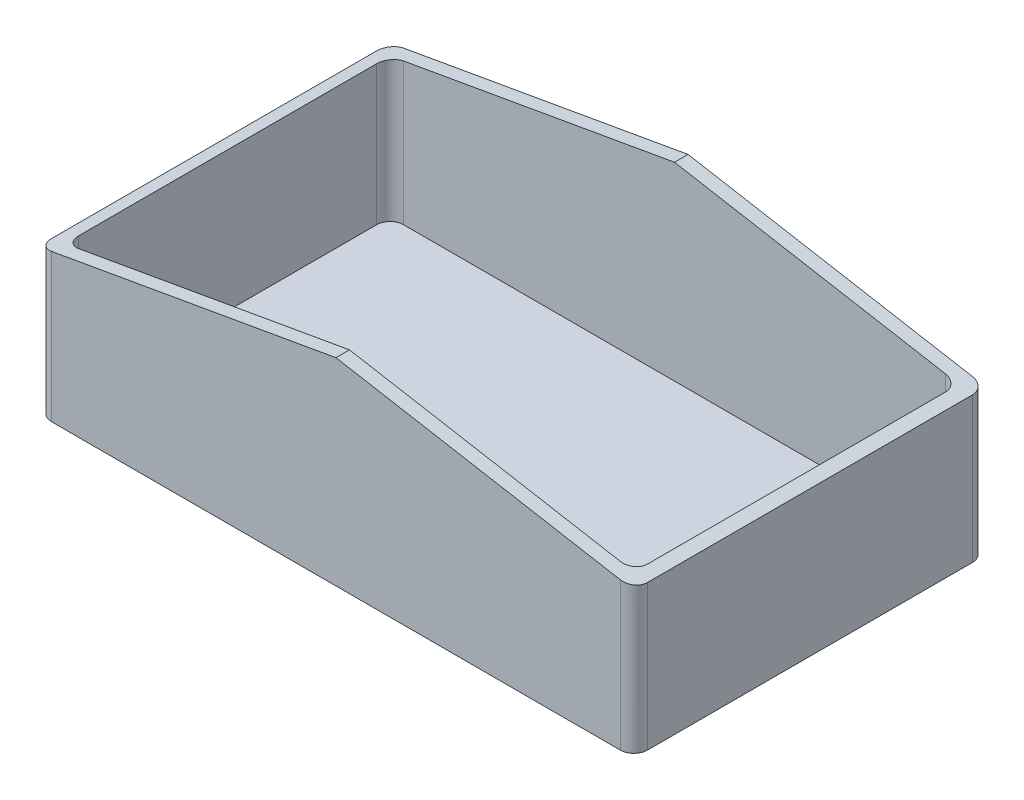
ISO-10303-21;
HEADER;
FILE_DESCRIPTION(('STEP AP214'),'2;1');
FILE_NAME('part.step','',(''),(''),'','','');
FILE_SCHEMA(('AUTOMOTIVE_DESIGN { 1 0 10303 214 1 1 1 1 }'));
ENDSEC;
DATA;
#1=APPLICATION_CONTEXT('core data for automotive mechanical design processes');
#2=APPLICATION_PROTOCOL_DEFINITION('international standard','automotive_design',2000,#1);
#3=PRODUCT_CONTEXT('',#1,'mechanical');
#4=PRODUCT('Part','Part','',(#3));
#5=PRODUCT_RELATED_PRODUCT_CATEGORY('part','',(#4));
#6=PRODUCT_DEFINITION_FORMATION('','',#4);
#7=PRODUCT_DEFINITION_CONTEXT('part definition',#1,'design');
#8=PRODUCT_DEFINITION('design','',#6,#7);
#9=PRODUCT_DEFINITION_SHAPE('','',#8);
#10=(LENGTH_UNIT() NAMED_UNIT(*) SI_UNIT(.MILLI.,.METRE.));
#11=(NAMED_UNIT(*) PLANE_ANGLE_UNIT() SI_UNIT($,.RADIAN.));
#12=(NAMED_UNIT(*) SI_UNIT($,.STERADIAN.) SOLID_ANGLE_UNIT());
#13=UNCERTAINTY_MEASURE_WITH_UNIT(LENGTH_MEASURE(1.E-05),#10,'distance_accuracy_value','');
#14=(GEOMETRIC_REPRESENTATION_CONTEXT(3) GLOBAL_UNCERTAINTY_ASSIGNED_CONTEXT((#13)) GLOBAL_UNIT_ASSIGNED_CONTEXT((#10,
#11,#12)) REPRESENTATION_CONTEXT('',''));
#15=CARTESIAN_POINT('',(0.,0.,0.));
#16=DIRECTION('',(0.,0.,1.));
#17=DIRECTION('',(1.,0.,0.));
#18=AXIS2_PLACEMENT_3D('',#15,#16,#17);
#19=CARTESIAN_POINT('',(-1050.,30.,600.));
#20=DIRECTION('',(0.,-1.,0.));
#21=DIRECTION('',(0.,0.,-1.));
#22=AXIS2_PLACEMENT_3D('',#19,#20,#21);
#23=CYLINDRICAL_SURFACE('',#22,50.);
#24=CARTESIAN_POINT('',(-1050.,544.856670256111,600.));
#25=DIRECTION('',(-0.173648177666931,0.984807753012208,0.));
#26=DIRECTION('',(-0.984807753012208,-0.173648177666931,0.));
#27=AXIS2_PLACEMENT_3D('',#24,#25,#26);
#28=ELLIPSE('',#27,50.7713305942873,50.);
#29=CARTESIAN_POINT('',(-1050.,544.856670256111,650.));
#30=VERTEX_POINT('',#29);
#31=CARTESIAN_POINT('',(-1100.,536.040321220688,600.));
#32=VERTEX_POINT('',#31);
#33=EDGE_CURVE('E303',#30,#32,#28,.F.);
#34=ORIENTED_EDGE('',*,*,#33,.T.);
#35=DIRECTION('',(0.,-1.,0.));
#36=VECTOR('',#35,1.);
#37=CARTESIAN_POINT('',(-1100.,30.,600.));
#38=LINE('',#37,#36);
#39=CARTESIAN_POINT('',(-1100.,0.,600.));
#40=VERTEX_POINT('',#39);
#41=EDGE_CURVE('E217',#32,#40,#38,.T.);
#42=ORIENTED_EDGE('',*,*,#41,.T.);
#43=CARTESIAN_POINT('',(-1050.,0.,600.));
#44=DIRECTION('',(0.,1.,0.));
#45=DIRECTION('',(0.,0.,-1.));
#46=AXIS2_PLACEMENT_3D('',#43,#44,#45);
#47=CIRCLE('',#46,50.);
#48=CARTESIAN_POINT('',(-1050.,0.,650.));
#49=VERTEX_POINT('',#48);
#50=EDGE_CURVE('E237',#40,#49,#47,.T.);
#51=ORIENTED_EDGE('',*,*,#50,.T.);
#52=DIRECTION('',(0.,-1.,0.));
#53=VECTOR('',#52,1.);
#54=CARTESIAN_POINT('',(-1050.,30.,650.));
#55=LINE('',#54,#53);
#56=EDGE_CURVE('E62',#30,#49,#55,.T.);
#57=ORIENTED_EDGE('',*,*,#56,.F.);
#58=EDGE_LOOP('',(#34,#42,#51,#57));
#59=FACE_BOUND('',#58,.T.);
#60=ADVANCED_FACE('F55',(#59),#23,.T.);
#61=CARTESIAN_POINT('',(-1050.,30.,650.));
#62=DIRECTION('',(0.,0.,-1.));
#63=DIRECTION('',(-1.,0.,0.));
#64=AXIS2_PLACEMENT_3D('',#61,#62,#63);
#65=PLANE('',#64);
#66=DIRECTION('',(0.,-1.,0.));
#67=VECTOR('',#66,1.);
#68=CARTESIAN_POINT('',(1050.,30.,650.));
#69=LINE('',#68,#67);
#70=CARTESIAN_POINT('',(1050.,544.856670256111,650.));
#71=VERTEX_POINT('',#70);
#72=CARTESIAN_POINT('',(1050.,0.,650.));
#73=VERTEX_POINT('',#72);
#74=EDGE_CURVE('E197',#71,#73,#69,.T.);
#75=ORIENTED_EDGE('',*,*,#74,.F.);
#76=DIRECTION('',(0.984807753012208,-0.173648177666931,0.));
#77=VECTOR('',#76,1.);
#78=CARTESIAN_POINT('',(124.837352313869,707.987806586856,650.));
#79=LINE('',#78,#77);
#80=CARTESIAN_POINT('',(0.,730.,650.));
#81=VERTEX_POINT('',#80);
#82=EDGE_CURVE('E179',#81,#71,#79,.T.);
#83=ORIENTED_EDGE('',*,*,#82,.F.);
#84=DIRECTION('',(-0.984807753012208,-0.173648177666931,0.));
#85=VECTOR('',#84,1.);
#86=CARTESIAN_POINT('',(-124.83735231387,707.987806586856,650.));
#87=LINE('',#86,#85);
#88=EDGE_CURVE('E289',#81,#30,#87,.T.);
#89=ORIENTED_EDGE('',*,*,#88,.T.);
#90=ORIENTED_EDGE('',*,*,#56,.T.);
#91=DIRECTION('',(1.,0.,0.));
#92=VECTOR('',#91,1.);
#93=CARTESIAN_POINT('',(-1050.,0.,650.));
#94=LINE('',#93,#92);
#95=EDGE_CURVE('E204',#49,#73,#94,.T.);
#96=ORIENTED_EDGE('',*,*,#95,.T.);
#97=EDGE_LOOP('',(#75,#83,#89,#90,#96));
#98=FACE_BOUND('',#97,.T.);
#99=ADVANCED_FACE('F202',(#98),#65,.F.);
#100=CARTESIAN_POINT('',(-1050.,30.,-650.));
#101=DIRECTION('',(0.,0.,1.));
#102=DIRECTION('',(1.,0.,0.));
#103=AXIS2_PLACEMENT_3D('',#100,#101,#102);
#104=PLANE('',#103);
#105=DIRECTION('',(0.984807753012208,0.173648177666931,0.));
#106=VECTOR('',#105,1.);
#107=CARTESIAN_POINT('',(-124.83735231387,707.987806586856,-650.));
#108=LINE('',#107,#106);
#109=CARTESIAN_POINT('',(-1050.,544.856670256111,-650.));
#110=VERTEX_POINT('',#109);
#111=CARTESIAN_POINT('',(0.,730.,-650.));
#112=VERTEX_POINT('',#111);
#113=EDGE_CURVE('E293',#110,#112,#108,.T.);
#114=ORIENTED_EDGE('',*,*,#113,.T.);
#115=DIRECTION('',(-0.984807753012208,0.173648177666931,0.));
#116=VECTOR('',#115,1.);
#117=CARTESIAN_POINT('',(124.837352313869,707.987806586856,-650.));
#118=LINE('',#117,#116);
#119=CARTESIAN_POINT('',(1050.,544.856670256111,-650.));
#120=VERTEX_POINT('',#119);
#121=EDGE_CURVE('E191',#120,#112,#118,.T.);
#122=ORIENTED_EDGE('',*,*,#121,.F.);
#123=DIRECTION('',(0.,-1.,0.));
#124=VECTOR('',#123,1.);
#125=CARTESIAN_POINT('',(1050.,30.,-650.));
#126=LINE('',#125,#124);
#127=CARTESIAN_POINT('',(1050.,0.,-650.));
#128=VERTEX_POINT('',#127);
#129=EDGE_CURVE('E211',#120,#128,#126,.T.);
#130=ORIENTED_EDGE('',*,*,#129,.T.);
#131=DIRECTION('',(-1.,0.,0.));
#132=VECTOR('',#131,1.);
#133=CARTESIAN_POINT('',(-1050.,0.,-650.));
#134=LINE('',#133,#132);
#135=CARTESIAN_POINT('',(-1050.,0.,-650.));
#136=VERTEX_POINT('',#135);
#137=EDGE_CURVE('E225',#128,#136,#134,.T.);
#138=ORIENTED_EDGE('',*,*,#137,.T.);
#139=DIRECTION('',(0.,-1.,0.));
#140=VECTOR('',#139,1.);
#141=CARTESIAN_POINT('',(-1050.,30.,-650.));
#142=LINE('',#141,#140);
#143=EDGE_CURVE('E213',#110,#136,#142,.T.);
#144=ORIENTED_EDGE('',*,*,#143,.F.);
#145=EDGE_LOOP('',(#114,#122,#130,#138,#144));
#146=FACE_BOUND('',#145,.T.);
#147=ADVANCED_FACE('F325',(#146),#104,.F.);
#148=CARTESIAN_POINT('',(-1050.,30.,-600.));
#149=DIRECTION('',(0.,-1.,0.));
#150=DIRECTION('',(0.,0.,-1.));
#151=AXIS2_PLACEMENT_3D('',#148,#149,#150);
#152=CYLINDRICAL_SURFACE('',#151,50.);
#153=CARTESIAN_POINT('',(-1050.,544.856670256111,-600.));
#154=DIRECTION('',(-0.173648177666931,0.984807753012208,0.));
#155=DIRECTION('',(-0.984807753012208,-0.173648177666931,0.));
#156=AXIS2_PLACEMENT_3D('',#153,#154,#155);
#157=ELLIPSE('',#156,50.7713305942873,50.);
#158=CARTESIAN_POINT('',(-1100.,536.040321220688,-600.));
#159=VERTEX_POINT('',#158);
#160=EDGE_CURVE('E296',#159,#110,#157,.F.);
#161=ORIENTED_EDGE('',*,*,#160,.T.);
#162=ORIENTED_EDGE('',*,*,#143,.T.);
#163=CARTESIAN_POINT('',(-1050.,0.,-600.));
#164=DIRECTION('',(0.,1.,0.));
#165=DIRECTION('',(0.,0.,-1.));
#166=AXIS2_PLACEMENT_3D('',#163,#164,#165);
#167=CIRCLE('',#166,50.);
#168=CARTESIAN_POINT('',(-1100.,0.,-600.));
#169=VERTEX_POINT('',#168);
#170=EDGE_CURVE('E222',#136,#169,#167,.T.);
#171=ORIENTED_EDGE('',*,*,#170,.T.);
#172=DIRECTION('',(0.,-1.,0.));
#173=VECTOR('',#172,1.);
#174=CARTESIAN_POINT('',(-1100.,30.,-600.));
#175=LINE('',#174,#173);
#176=EDGE_CURVE('E215',#159,#169,#175,.T.);
#177=ORIENTED_EDGE('',*,*,#176,.F.);
#178=EDGE_LOOP('',(#161,#162,#171,#177));
#179=FACE_BOUND('',#178,.T.);
#180=ADVANCED_FACE('F329',(#179),#152,.T.);
#181=CARTESIAN_POINT('',(-1100.,30.,600.));
#182=DIRECTION('',(1.,0.,0.));
#183=DIRECTION('',(0.,0.,-1.));
#184=AXIS2_PLACEMENT_3D('',#181,#182,#183);
#185=PLANE('',#184);
#186=DIRECTION('',(0.,0.,-1.));
#187=VECTOR('',#186,1.);
#188=CARTESIAN_POINT('',(-1100.,536.040321220688,-650.002));
#189=LINE('',#188,#187);
#190=EDGE_CURVE('E300',#32,#159,#189,.T.);
#191=ORIENTED_EDGE('',*,*,#190,.T.);
#192=ORIENTED_EDGE('',*,*,#176,.T.);
#193=DIRECTION('',(0.,0.,1.));
#194=VECTOR('',#193,1.);
#195=CARTESIAN_POINT('',(-1100.,0.,600.));
#196=LINE('',#195,#194);
#197=EDGE_CURVE('E219',#169,#40,#196,.T.);
#198=ORIENTED_EDGE('',*,*,#197,.T.);
#199=ORIENTED_EDGE('',*,*,#41,.F.);
#200=EDGE_LOOP('',(#191,#192,#198,#199));
#201=FACE_BOUND('',#200,.T.);
#202=ADVANCED_FACE('F334',(#201),#185,.F.);
#203=CARTESIAN_POINT('',(-1000.,730.,-550.));
#204=DIRECTION('',(0.,-1.,0.));
#205=DIRECTION('',(0.,0.,-1.));
#206=AXIS2_PLACEMENT_3D('',#203,#204,#205);
#207=CYLINDRICAL_SURFACE('',#206,50.);
#208=DIRECTION('',(0.,-1.,0.));
#209=VECTOR('',#208,1.);
#210=CARTESIAN_POINT('',(-1000.,730.,-600.));
#211=LINE('',#210,#209);
#212=CARTESIAN_POINT('',(-1000.,553.673019291535,-600.));
#213=VERTEX_POINT('',#212);
#214=CARTESIAN_POINT('',(-1000.,30.,-600.));
#215=VERTEX_POINT('',#214);
#216=EDGE_CURVE('E75',#213,#215,#211,.T.);
#217=ORIENTED_EDGE('',*,*,#216,.F.);
#218=CARTESIAN_POINT('',(-1000.,553.673019291534,-550.));
#219=DIRECTION('',(-0.173648177666931,0.984807753012208,0.));
#220=DIRECTION('',(-0.984807753012208,-0.173648177666931,0.));
#221=AXIS2_PLACEMENT_3D('',#218,#219,#220);
#222=ELLIPSE('',#221,50.7713305942873,50.);
#223=CARTESIAN_POINT('',(-1050.,544.856670256111,-550.));
#224=VERTEX_POINT('',#223);
#225=EDGE_CURVE('E69',#213,#224,#222,.T.);
#226=ORIENTED_EDGE('',*,*,#225,.T.);
#227=DIRECTION('',(0.,-1.,0.));
#228=VECTOR('',#227,1.);
#229=CARTESIAN_POINT('',(-1050.,730.,-550.));
#230=LINE('',#229,#228);
#231=CARTESIAN_POINT('',(-1050.,30.,-550.));
#232=VERTEX_POINT('',#231);
#233=EDGE_CURVE('E240',#224,#232,#230,.T.);
#234=ORIENTED_EDGE('',*,*,#233,.T.);
#235=CARTESIAN_POINT('',(-1000.,30.,-550.));
#236=DIRECTION('',(0.,1.,0.));
#237=DIRECTION('',(0.,0.,-1.));
#238=AXIS2_PLACEMENT_3D('',#235,#236,#237);
#239=CIRCLE('',#238,50.);
#240=EDGE_CURVE('E276',#215,#232,#239,.T.);
#241=ORIENTED_EDGE('',*,*,#240,.F.);
#242=EDGE_LOOP('',(#217,#226,#234,#241));
#243=FACE_BOUND('',#242,.T.);
#244=ADVANCED_FACE('F399',(#243),#207,.F.);
#245=CARTESIAN_POINT('',(-1050.,730.,550.));
#246=DIRECTION('',(1.,0.,0.));
#247=DIRECTION('',(0.,0.,-1.));
#248=AXIS2_PLACEMENT_3D('',#245,#246,#247);
#249=PLANE('',#248);
#250=ORIENTED_EDGE('',*,*,#233,.F.);
#251=DIRECTION('',(0.,0.,1.));
#252=VECTOR('',#251,1.);
#253=CARTESIAN_POINT('',(-1050.,544.856670256111,550.));
#254=LINE('',#253,#252);
#255=CARTESIAN_POINT('',(-1050.,544.856670256111,550.));
#256=VERTEX_POINT('',#255);
#257=EDGE_CURVE('E285',#224,#256,#254,.T.);
#258=ORIENTED_EDGE('',*,*,#257,.T.);
#259=DIRECTION('',(0.,-1.,0.));
#260=VECTOR('',#259,1.);
#261=CARTESIAN_POINT('',(-1050.,730.,550.));
#262=LINE('',#261,#260);
#263=CARTESIAN_POINT('',(-1050.,30.,550.));
#264=VERTEX_POINT('',#263);
#265=EDGE_CURVE('E242',#256,#264,#262,.T.);
#266=ORIENTED_EDGE('',*,*,#265,.T.);
#267=DIRECTION('',(0.,0.,1.));
#268=VECTOR('',#267,1.);
#269=CARTESIAN_POINT('',(-1050.,30.,550.));
#270=LINE('',#269,#268);
#271=EDGE_CURVE('E273',#232,#264,#270,.T.);
#272=ORIENTED_EDGE('',*,*,#271,.F.);
#273=EDGE_LOOP('',(#250,#258,#266,#272));
#274=FACE_BOUND('',#273,.T.);
#275=ADVANCED_FACE('F395',(#274),#249,.T.);
#276=CARTESIAN_POINT('',(-1000.,730.,550.));
#277=DIRECTION('',(0.,-1.,0.));
#278=DIRECTION('',(0.,0.,-1.));
#279=AXIS2_PLACEMENT_3D('',#276,#277,#278);
#280=CYLINDRICAL_SURFACE('',#279,50.);
#281=ORIENTED_EDGE('',*,*,#265,.F.);
#282=CARTESIAN_POINT('',(-1000.,553.673019291534,550.));
#283=DIRECTION('',(-0.173648177666931,0.984807753012208,0.));
#284=DIRECTION('',(-0.984807753012208,-0.173648177666931,0.));
#285=AXIS2_PLACEMENT_3D('',#282,#283,#284);
#286=ELLIPSE('',#285,50.7713305942873,50.);
#287=CARTESIAN_POINT('',(-1000.,553.673019291534,600.));
#288=VERTEX_POINT('',#287);
#289=EDGE_CURVE('E282',#256,#288,#286,.T.);
#290=ORIENTED_EDGE('',*,*,#289,.T.);
#291=DIRECTION('',(0.,-1.,0.));
#292=VECTOR('',#291,1.);
#293=CARTESIAN_POINT('',(-1000.,730.,600.));
#294=LINE('',#293,#292);
#295=CARTESIAN_POINT('',(-1000.,30.,600.));
#296=VERTEX_POINT('',#295);
#297=EDGE_CURVE('E244',#288,#296,#294,.T.);
#298=ORIENTED_EDGE('',*,*,#297,.T.);
#299=CARTESIAN_POINT('',(-1000.,30.,550.));
#300=DIRECTION('',(0.,1.,0.));
#301=DIRECTION('',(0.,0.,-1.));
#302=AXIS2_PLACEMENT_3D('',#299,#300,#301);
#303=CIRCLE('',#302,50.);
#304=EDGE_CURVE('E270',#264,#296,#303,.T.);
#305=ORIENTED_EDGE('',*,*,#304,.F.);
#306=EDGE_LOOP('',(#281,#290,#298,#305));
#307=FACE_BOUND('',#306,.T.);
#308=ADVANCED_FACE('F375',(#307),#280,.F.);
#309=CARTESIAN_POINT('',(-1000.,730.,600.));
#310=DIRECTION('',(0.,0.,-1.));
#311=DIRECTION('',(-1.,0.,0.));
#312=AXIS2_PLACEMENT_3D('',#309,#310,#311);
#313=PLANE('',#312);
#314=DIRECTION('',(-0.984807753012208,0.173648177666931,0.));
#315=VECTOR('',#314,1.);
#316=CARTESIAN_POINT('',(-969.846310392954,901.010071662835,600.));
#317=LINE('',#316,#315);
#318=CARTESIAN_POINT('',(1000.,553.673019291535,600.));
#319=VERTEX_POINT('',#318);
#320=CARTESIAN_POINT('',(0.,730.,600.));
#321=VERTEX_POINT('',#320);
#322=EDGE_CURVE('E297',#319,#321,#317,.T.);
#323=ORIENTED_EDGE('',*,*,#322,.F.);
#324=DIRECTION('',(0.,-1.,0.));
#325=VECTOR('',#324,1.);
#326=CARTESIAN_POINT('',(1000.,730.,600.));
#327=LINE('',#326,#325);
#328=CARTESIAN_POINT('',(1000.,30.,600.));
#329=VERTEX_POINT('',#328);
#330=EDGE_CURVE('E246',#319,#329,#327,.T.);
#331=ORIENTED_EDGE('',*,*,#330,.T.);
#332=DIRECTION('',(1.,0.,0.));
#333=VECTOR('',#332,1.);
#334=CARTESIAN_POINT('',(-1000.,30.,600.));
#335=LINE('',#334,#333);
#336=EDGE_CURVE('E267',#296,#329,#335,.T.);
#337=ORIENTED_EDGE('',*,*,#336,.F.);
#338=ORIENTED_EDGE('',*,*,#297,.F.);
#339=DIRECTION('',(0.984807753012208,0.173648177666931,0.));
#340=VECTOR('',#339,1.);
#341=CARTESIAN_POINT('',(-969.846310392954,558.989928337165,600.));
#342=LINE('',#341,#340);
#343=EDGE_CURVE('E279',#288,#321,#342,.T.);
#344=ORIENTED_EDGE('',*,*,#343,.T.);
#345=EDGE_LOOP('',(#323,#331,#337,#338,#344));
#346=FACE_BOUND('',#345,.T.);
#347=ADVANCED_FACE('F370',(#346),#313,.T.);
#348=CARTESIAN_POINT('',(-1000.,730.,-600.));
#349=DIRECTION('',(0.,0.,1.));
#350=DIRECTION('',(1.,0.,0.));
#351=AXIS2_PLACEMENT_3D('',#348,#349,#350);
#352=PLANE('',#351);
#353=DIRECTION('',(0.984807753012208,-0.173648177666931,0.));
#354=VECTOR('',#353,1.);
#355=CARTESIAN_POINT('',(-969.846310392954,901.010071662835,-600.));
#356=LINE('',#355,#354);
#357=CARTESIAN_POINT('',(0.,730.,-600.));
#358=VERTEX_POINT('',#357);
#359=CARTESIAN_POINT('',(1000.,553.673019291535,-600.));
#360=VERTEX_POINT('',#359);
#361=EDGE_CURVE('E307',#358,#360,#356,.T.);
#362=ORIENTED_EDGE('',*,*,#361,.F.);
#363=DIRECTION('',(-0.984807753012208,-0.173648177666931,0.));
#364=VECTOR('',#363,1.);
#365=CARTESIAN_POINT('',(-969.846310392954,558.989928337165,-600.));
#366=LINE('',#365,#364);
#367=EDGE_CURVE('E12',#358,#213,#366,.T.);
#368=ORIENTED_EDGE('',*,*,#367,.T.);
#369=ORIENTED_EDGE('',*,*,#216,.T.);
#370=DIRECTION('',(-1.,0.,0.));
#371=VECTOR('',#370,1.);
#372=CARTESIAN_POINT('',(-1000.,30.,-600.));
#373=LINE('',#372,#371);
#374=CARTESIAN_POINT('',(1000.,30.,-600.));
#375=VERTEX_POINT('',#374);
#376=EDGE_CURVE('E255',#375,#215,#373,.T.);
#377=ORIENTED_EDGE('',*,*,#376,.F.);
#378=DIRECTION('',(0.,-1.,0.));
#379=VECTOR('',#378,1.);
#380=CARTESIAN_POINT('',(1000.,730.,-600.));
#381=LINE('',#380,#379);
#382=EDGE_CURVE('E252',#360,#375,#381,.T.);
#383=ORIENTED_EDGE('',*,*,#382,.F.);
#384=EDGE_LOOP('',(#362,#368,#369,#377,#383));
#385=FACE_BOUND('',#384,.T.);
#386=ADVANCED_FACE('F366',(#385),#352,.T.);
#387=CARTESIAN_POINT('',(1050.,30.,600.));
#388=DIRECTION('',(0.,-1.,0.));
#389=DIRECTION('',(0.,0.,-1.));
#390=AXIS2_PLACEMENT_3D('',#387,#388,#389);
#391=CYLINDRICAL_SURFACE('',#390,50.);
#392=DIRECTION('',(0.,-1.,0.));
#393=VECTOR('',#392,1.);
#394=CARTESIAN_POINT('',(1100.,30.,600.));
#395=LINE('',#394,#393);
#396=CARTESIAN_POINT('',(1100.,536.040321220688,600.));
#397=VERTEX_POINT('',#396);
#398=CARTESIAN_POINT('',(1100.,0.,600.));
#399=VERTEX_POINT('',#398);
#400=EDGE_CURVE('E199',#397,#399,#395,.T.);
#401=ORIENTED_EDGE('',*,*,#400,.F.);
#402=CARTESIAN_POINT('',(1050.,544.856670256111,600.));
#403=DIRECTION('',(-0.173648177666931,-0.984807753012208,0.));
#404=DIRECTION('',(0.984807753012208,-0.173648177666931,0.));
#405=AXIS2_PLACEMENT_3D('',#402,#403,#404);
#406=ELLIPSE('',#405,50.7713305942873,50.);
#407=EDGE_CURVE('E182',#71,#397,#406,.F.);
#408=ORIENTED_EDGE('',*,*,#407,.F.);
#409=ORIENTED_EDGE('',*,*,#74,.T.);
#410=CARTESIAN_POINT('',(1050.,0.,600.));
#411=DIRECTION('',(0.,1.,0.));
#412=DIRECTION('',(0.,0.,1.));
#413=AXIS2_PLACEMENT_3D('',#410,#411,#412);
#414=CIRCLE('',#413,50.);
#415=EDGE_CURVE('E234',#73,#399,#414,.T.);
#416=ORIENTED_EDGE('',*,*,#415,.T.);
#417=EDGE_LOOP('',(#401,#408,#409,#416));
#418=FACE_BOUND('',#417,.T.);
#419=ADVANCED_FACE('F195',(#418),#391,.T.);
#420=CARTESIAN_POINT('',(1100.,30.,600.));
#421=DIRECTION('',(-1.,0.,0.));
#422=DIRECTION('',(0.,0.,1.));
#423=AXIS2_PLACEMENT_3D('',#420,#421,#422);
#424=PLANE('',#423);
#425=DIRECTION('',(0.,-1.,0.));
#426=VECTOR('',#425,1.);
#427=CARTESIAN_POINT('',(1100.,30.,-600.));
#428=LINE('',#427,#426);
#429=CARTESIAN_POINT('',(1100.,536.040321220688,-600.));
#430=VERTEX_POINT('',#429);
#431=CARTESIAN_POINT('',(1100.,0.,-600.));
#432=VERTEX_POINT('',#431);
#433=EDGE_CURVE('E207',#430,#432,#428,.T.);
#434=ORIENTED_EDGE('',*,*,#433,.F.);
#435=DIRECTION('',(0.,0.,-1.));
#436=VECTOR('',#435,1.);
#437=CARTESIAN_POINT('',(1100.,536.040321220688,-650.002));
#438=LINE('',#437,#436);
#439=EDGE_CURVE('E200',#397,#430,#438,.T.);
#440=ORIENTED_EDGE('',*,*,#439,.F.);
#441=ORIENTED_EDGE('',*,*,#400,.T.);
#442=DIRECTION('',(0.,0.,-1.));
#443=VECTOR('',#442,1.);
#444=CARTESIAN_POINT('',(1100.,0.,600.));
#445=LINE('',#444,#443);
#446=EDGE_CURVE('E231',#399,#432,#445,.T.);
#447=ORIENTED_EDGE('',*,*,#446,.T.);
#448=EDGE_LOOP('',(#434,#440,#441,#447));
#449=FACE_BOUND('',#448,.T.);
#450=ADVANCED_FACE('F344',(#449),#424,.F.);
#451=CARTESIAN_POINT('',(1050.,30.,-600.));
#452=DIRECTION('',(0.,-1.,0.));
#453=DIRECTION('',(0.,0.,-1.));
#454=AXIS2_PLACEMENT_3D('',#451,#452,#453);
#455=CYLINDRICAL_SURFACE('',#454,50.);
#456=ORIENTED_EDGE('',*,*,#129,.F.);
#457=CARTESIAN_POINT('',(1050.,544.856670256111,-600.));
#458=DIRECTION('',(-0.173648177666931,-0.984807753012208,0.));
#459=DIRECTION('',(0.984807753012208,-0.173648177666931,0.));
#460=AXIS2_PLACEMENT_3D('',#457,#458,#459);
#461=ELLIPSE('',#460,50.7713305942873,50.);
#462=EDGE_CURVE('E315',#430,#120,#461,.F.);
#463=ORIENTED_EDGE('',*,*,#462,.F.);
#464=ORIENTED_EDGE('',*,*,#433,.T.);
#465=CARTESIAN_POINT('',(1050.,0.,-600.));
#466=DIRECTION('',(0.,1.,0.));
#467=DIRECTION('',(0.,0.,-1.));
#468=AXIS2_PLACEMENT_3D('',#465,#466,#467);
#469=CIRCLE('',#468,50.);
#470=EDGE_CURVE('E228',#432,#128,#469,.T.);
#471=ORIENTED_EDGE('',*,*,#470,.T.);
#472=EDGE_LOOP('',(#456,#463,#464,#471));
#473=FACE_BOUND('',#472,.T.);
#474=ADVANCED_FACE('F346',(#473),#455,.T.);
#475=CARTESIAN_POINT('',(-1050.,0.,600.));
#476=DIRECTION('',(0.,-1.,0.));
#477=DIRECTION('',(0.,0.,-1.));
#478=AXIS2_PLACEMENT_3D('',#475,#476,#477);
#479=PLANE('',#478);
#480=ORIENTED_EDGE('',*,*,#50,.F.);
#481=ORIENTED_EDGE('',*,*,#197,.F.);
#482=ORIENTED_EDGE('',*,*,#170,.F.);
#483=ORIENTED_EDGE('',*,*,#137,.F.);
#484=ORIENTED_EDGE('',*,*,#470,.F.);
#485=ORIENTED_EDGE('',*,*,#446,.F.);
#486=ORIENTED_EDGE('',*,*,#415,.F.);
#487=ORIENTED_EDGE('',*,*,#95,.F.);
#488=EDGE_LOOP('',(#480,#481,#482,#483,#484,#485,#486,#487));
#489=FACE_BOUND('',#488,.T.);
#490=ADVANCED_FACE('F339',(#489),#479,.T.);
#491=CARTESIAN_POINT('',(1000.,730.,550.));
#492=DIRECTION('',(0.,-1.,0.));
#493=DIRECTION('',(0.,0.,-1.));
#494=AXIS2_PLACEMENT_3D('',#491,#492,#493);
#495=CYLINDRICAL_SURFACE('',#494,50.);
#496=CARTESIAN_POINT('',(1000.,553.673019291535,550.));
#497=DIRECTION('',(-0.173648177666931,-0.984807753012208,0.));
#498=DIRECTION('',(0.984807753012208,-0.173648177666931,0.));
#499=AXIS2_PLACEMENT_3D('',#496,#497,#498);
#500=ELLIPSE('',#499,50.7713305942873,50.);
#501=CARTESIAN_POINT('',(1050.,544.856670256111,550.));
#502=VERTEX_POINT('',#501);
#503=EDGE_CURVE('E309',#502,#319,#500,.T.);
#504=ORIENTED_EDGE('',*,*,#503,.F.);
#505=DIRECTION('',(0.,-1.,0.));
#506=VECTOR('',#505,1.);
#507=CARTESIAN_POINT('',(1050.,730.,550.));
#508=LINE('',#507,#506);
#509=CARTESIAN_POINT('',(1050.,30.,550.));
#510=VERTEX_POINT('',#509);
#511=EDGE_CURVE('E248',#502,#510,#508,.T.);
#512=ORIENTED_EDGE('',*,*,#511,.T.);
#513=CARTESIAN_POINT('',(1000.,30.,550.));
#514=DIRECTION('',(0.,1.,0.));
#515=DIRECTION('',(0.,0.,1.));
#516=AXIS2_PLACEMENT_3D('',#513,#514,#515);
#517=CIRCLE('',#516,50.);
#518=EDGE_CURVE('E264',#329,#510,#517,.T.);
#519=ORIENTED_EDGE('',*,*,#518,.F.);
#520=ORIENTED_EDGE('',*,*,#330,.F.);
#521=EDGE_LOOP('',(#504,#512,#519,#520));
#522=FACE_BOUND('',#521,.T.);
#523=ADVANCED_FACE('F353',(#522),#495,.F.);
#524=CARTESIAN_POINT('',(1050.,730.,550.));
#525=DIRECTION('',(-1.,0.,0.));
#526=DIRECTION('',(0.,0.,1.));
#527=AXIS2_PLACEMENT_3D('',#524,#525,#526);
#528=PLANE('',#527);
#529=DIRECTION('',(0.,0.,1.));
#530=VECTOR('',#529,1.);
#531=CARTESIAN_POINT('',(1050.,544.856670256111,550.));
#532=LINE('',#531,#530);
#533=CARTESIAN_POINT('',(1050.,544.856670256111,-550.));
#534=VERTEX_POINT('',#533);
#535=EDGE_CURVE('E311',#534,#502,#532,.T.);
#536=ORIENTED_EDGE('',*,*,#535,.F.);
#537=DIRECTION('',(0.,-1.,0.));
#538=VECTOR('',#537,1.);
#539=CARTESIAN_POINT('',(1050.,730.,-550.));
#540=LINE('',#539,#538);
#541=CARTESIAN_POINT('',(1050.,30.,-550.));
#542=VERTEX_POINT('',#541);
#543=EDGE_CURVE('E250',#534,#542,#540,.T.);
#544=ORIENTED_EDGE('',*,*,#543,.T.);
#545=DIRECTION('',(0.,0.,-1.));
#546=VECTOR('',#545,1.);
#547=CARTESIAN_POINT('',(1050.,30.,550.));
#548=LINE('',#547,#546);
#549=EDGE_CURVE('E261',#510,#542,#548,.T.);
#550=ORIENTED_EDGE('',*,*,#549,.F.);
#551=ORIENTED_EDGE('',*,*,#511,.F.);
#552=EDGE_LOOP('',(#536,#544,#550,#551));
#553=FACE_BOUND('',#552,.T.);
#554=ADVANCED_FACE('F385',(#553),#528,.T.);
#555=CARTESIAN_POINT('',(1000.,730.,-550.));
#556=DIRECTION('',(0.,-1.,0.));
#557=DIRECTION('',(0.,0.,-1.));
#558=AXIS2_PLACEMENT_3D('',#555,#556,#557);
#559=CYLINDRICAL_SURFACE('',#558,50.);
#560=CARTESIAN_POINT('',(1000.,553.673019291535,-550.));
#561=DIRECTION('',(-0.173648177666931,-0.984807753012208,0.));
#562=DIRECTION('',(0.984807753012208,-0.173648177666931,0.));
#563=AXIS2_PLACEMENT_3D('',#560,#561,#562);
#564=ELLIPSE('',#563,50.7713305942873,50.);
#565=EDGE_CURVE('E190',#360,#534,#564,.T.);
#566=ORIENTED_EDGE('',*,*,#565,.F.);
#567=ORIENTED_EDGE('',*,*,#382,.T.);
#568=CARTESIAN_POINT('',(1000.,30.,-550.));
#569=DIRECTION('',(0.,1.,0.));
#570=DIRECTION('',(0.,0.,-1.));
#571=AXIS2_PLACEMENT_3D('',#568,#569,#570);
#572=CIRCLE('',#571,50.);
#573=EDGE_CURVE('E258',#542,#375,#572,.T.);
#574=ORIENTED_EDGE('',*,*,#573,.F.);
#575=ORIENTED_EDGE('',*,*,#543,.F.);
#576=EDGE_LOOP('',(#566,#567,#574,#575));
#577=FACE_BOUND('',#576,.T.);
#578=ADVANCED_FACE('F381',(#577),#559,.F.);
#579=CARTESIAN_POINT('',(-1050.,30.,600.));
#580=DIRECTION('',(0.,-1.,0.));
#581=DIRECTION('',(0.,0.,-1.));
#582=AXIS2_PLACEMENT_3D('',#579,#580,#581);
#583=PLANE('',#582);
#584=ORIENTED_EDGE('',*,*,#376,.T.);
#585=ORIENTED_EDGE('',*,*,#240,.T.);
#586=ORIENTED_EDGE('',*,*,#271,.T.);
#587=ORIENTED_EDGE('',*,*,#304,.T.);
#588=ORIENTED_EDGE('',*,*,#336,.T.);
#589=ORIENTED_EDGE('',*,*,#518,.T.);
#590=ORIENTED_EDGE('',*,*,#549,.T.);
#591=ORIENTED_EDGE('',*,*,#573,.T.);
#592=EDGE_LOOP('',(#584,#585,#586,#587,#588,#589,#590,#591));
#593=FACE_BOUND('',#592,.T.);
#594=ADVANCED_FACE('F384',(#593),#583,.F.);
#595=CARTESIAN_POINT('',(-124.83735231387,707.987806586856,-650.002));
#596=DIRECTION('',(-0.173648177666931,0.984807753012208,0.));
#597=DIRECTION('',(-0.984807753012208,-0.173648177666931,0.));
#598=AXIS2_PLACEMENT_3D('',#595,#596,#597);
#599=PLANE('',#598);
#600=ORIENTED_EDGE('',*,*,#289,.F.);
#601=ORIENTED_EDGE('',*,*,#257,.F.);
#602=ORIENTED_EDGE('',*,*,#225,.F.);
#603=ORIENTED_EDGE('',*,*,#367,.F.);
#604=DIRECTION('',(0.,0.,1.));
#605=VECTOR('',#604,1.);
#606=CARTESIAN_POINT('',(0.,730.,-650.002));
#607=LINE('',#606,#605);
#608=EDGE_CURVE('E291',#112,#358,#607,.T.);
#609=ORIENTED_EDGE('',*,*,#608,.F.);
#610=ORIENTED_EDGE('',*,*,#113,.F.);
#611=ORIENTED_EDGE('',*,*,#160,.F.);
#612=ORIENTED_EDGE('',*,*,#190,.F.);
#613=ORIENTED_EDGE('',*,*,#33,.F.);
#614=ORIENTED_EDGE('',*,*,#88,.F.);
#615=EDGE_CURVE('E185',#321,#81,#607,.T.);
#616=ORIENTED_EDGE('',*,*,#615,.F.);
#617=ORIENTED_EDGE('',*,*,#343,.F.);
#618=EDGE_LOOP('',(#600,#601,#602,#603,#609,#610,#611,#612,#613,#614,#616,#617));
#619=FACE_BOUND('',#618,.T.);
#620=ADVANCED_FACE('F323',(#619),#599,.T.);
#621=CARTESIAN_POINT('',(124.837352313869,707.987806586856,-650.002));
#622=DIRECTION('',(-0.173648177666931,-0.984807753012208,0.));
#623=DIRECTION('',(0.984807753012208,-0.173648177666931,0.));
#624=AXIS2_PLACEMENT_3D('',#621,#622,#623);
#625=PLANE('',#624);
#626=ORIENTED_EDGE('',*,*,#322,.T.);
#627=ORIENTED_EDGE('',*,*,#615,.T.);
#628=ORIENTED_EDGE('',*,*,#82,.T.);
#629=ORIENTED_EDGE('',*,*,#407,.T.);
#630=ORIENTED_EDGE('',*,*,#439,.T.);
#631=ORIENTED_EDGE('',*,*,#462,.T.);
#632=ORIENTED_EDGE('',*,*,#121,.T.);
#633=ORIENTED_EDGE('',*,*,#608,.T.);
#634=ORIENTED_EDGE('',*,*,#361,.T.);
#635=ORIENTED_EDGE('',*,*,#565,.T.);
#636=ORIENTED_EDGE('',*,*,#535,.T.);
#637=ORIENTED_EDGE('',*,*,#503,.T.);
#638=EDGE_LOOP('',(#626,#627,#628,#629,#630,#631,#632,#633,#634,#635,#636,#637));
#639=FACE_BOUND('',#638,.T.);
#640=ADVANCED_FACE('F181',(#639),#625,.F.);
#641=CLOSED_SHELL('',(#60,#99,#147,#180,#202,#244,#275,#308,#347,#386,#419,#450,#474,#490,#523,
#554,#578,#594,#620,#640));
#642=MANIFOLD_SOLID_BREP('B2',#641);
#643=ADVANCED_BREP_SHAPE_REPRESENTATION('',(#18,#642),#14);
#644=SHAPE_DEFINITION_REPRESENTATION(#9,#643);
ENDSEC;
END-ISO-10303-21;
